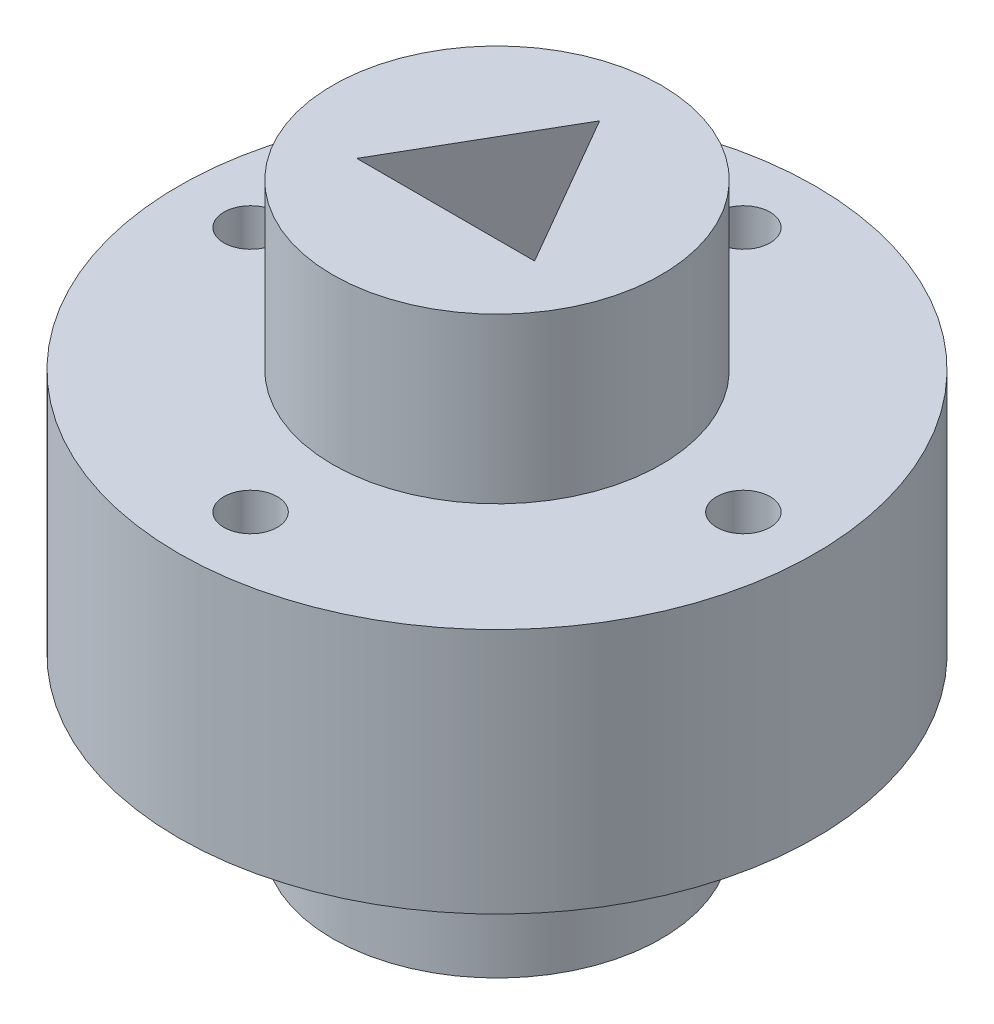
ISO-10303-21;
HEADER;
FILE_DESCRIPTION(('STEP AP214'),'2;1');
FILE_NAME('part.step','',(''),(''),'','','');
FILE_SCHEMA(('AUTOMOTIVE_DESIGN { 1 0 10303 214 1 1 1 1 }'));
ENDSEC;
DATA;
#1=APPLICATION_CONTEXT('core data for automotive mechanical design processes');
#2=APPLICATION_PROTOCOL_DEFINITION('international standard','automotive_design',2000,#1);
#3=PRODUCT_CONTEXT('',#1,'mechanical');
#4=PRODUCT('Part','Part','',(#3));
#5=PRODUCT_RELATED_PRODUCT_CATEGORY('part','',(#4));
#6=PRODUCT_DEFINITION_FORMATION('','',#4);
#7=PRODUCT_DEFINITION_CONTEXT('part definition',#1,'design');
#8=PRODUCT_DEFINITION('design','',#6,#7);
#9=PRODUCT_DEFINITION_SHAPE('','',#8);
#10=(LENGTH_UNIT() NAMED_UNIT(*) SI_UNIT(.MILLI.,.METRE.));
#11=(NAMED_UNIT(*) PLANE_ANGLE_UNIT() SI_UNIT($,.RADIAN.));
#12=(NAMED_UNIT(*) SI_UNIT($,.STERADIAN.) SOLID_ANGLE_UNIT());
#13=UNCERTAINTY_MEASURE_WITH_UNIT(LENGTH_MEASURE(1.E-05),#10,'distance_accuracy_value','');
#14=(GEOMETRIC_REPRESENTATION_CONTEXT(3) GLOBAL_UNCERTAINTY_ASSIGNED_CONTEXT((#13)) GLOBAL_UNIT_ASSIGNED_CONTEXT((#10,
#11,#12)) REPRESENTATION_CONTEXT('',''));
#15=CARTESIAN_POINT('',(0.,0.,0.));
#16=DIRECTION('',(0.,0.,1.));
#17=DIRECTION('',(1.,0.,0.));
#18=AXIS2_PLACEMENT_3D('',#15,#16,#17);
#19=CARTESIAN_POINT('',(0.,0.,0.));
#20=DIRECTION('',(0.,1.,0.));
#21=DIRECTION('',(0.,0.,1.));
#22=AXIS2_PLACEMENT_3D('',#19,#20,#21);
#23=PLANE('',#22);
#24=CARTESIAN_POINT('',(0.,0.,0.));
#25=DIRECTION('',(0.,1.,0.));
#26=DIRECTION('',(0.,0.,1.));
#27=AXIS2_PLACEMENT_3D('',#24,#25,#26);
#28=CIRCLE('',#27,4.);
#29=CARTESIAN_POINT('',(0.,0.,4.));
#30=VERTEX_POINT('',#29);
#31=EDGE_CURVE('E37',#30,#30,#28,.T.);
#32=ORIENTED_EDGE('',*,*,#31,.F.);
#33=EDGE_LOOP('',(#32));
#34=FACE_BOUND('',#33,.T.);
#35=DIRECTION('',(0.500000000000004,0.,0.866025403784436));
#36=VECTOR('',#35,1.);
#37=CARTESIAN_POINT('',(1.08253175473055,0.,-0.625000000000011));
#38=LINE('',#37,#36);
#39=CARTESIAN_POINT('',(0.,0.,-2.5));
#40=VERTEX_POINT('',#39);
#41=CARTESIAN_POINT('',(2.16506350946111,0.,1.24999999999998));
#42=VERTEX_POINT('',#41);
#43=EDGE_CURVE('E94',#40,#42,#38,.T.);
#44=ORIENTED_EDGE('',*,*,#43,.F.);
#45=DIRECTION('',(-0.500000000000004,0.,0.866025403784436));
#46=VECTOR('',#45,1.);
#47=CARTESIAN_POINT('',(-1.08253175473055,0.,-0.62500000000001));
#48=LINE('',#47,#46);
#49=CARTESIAN_POINT('',(-2.16506350946111,0.,1.24999999999998));
#50=VERTEX_POINT('',#49);
#51=EDGE_CURVE('E90',#40,#50,#48,.T.);
#52=ORIENTED_EDGE('',*,*,#51,.T.);
#53=DIRECTION('',(1.,0.,0.));
#54=VECTOR('',#53,1.);
#55=CARTESIAN_POINT('',(0.,0.,1.24999999999998));
#56=LINE('',#55,#54);
#57=EDGE_CURVE('E75',#50,#42,#56,.T.);
#58=ORIENTED_EDGE('',*,*,#57,.T.);
#59=EDGE_LOOP('',(#44,#52,#58));
#60=FACE_BOUND('',#59,.T.);
#61=ADVANCED_FACE('F33',(#34,#60),#23,.F.);
#62=CARTESIAN_POINT('',(0.,14.,0.));
#63=DIRECTION('',(0.,1.,0.));
#64=DIRECTION('',(0.,0.,1.));
#65=AXIS2_PLACEMENT_3D('',#62,#63,#64);
#66=PLANE('',#65);
#67=CARTESIAN_POINT('',(0.,14.,0.));
#68=DIRECTION('',(0.,1.,0.));
#69=DIRECTION('',(0.,0.,1.));
#70=AXIS2_PLACEMENT_3D('',#67,#68,#69);
#71=CIRCLE('',#70,4.);
#72=CARTESIAN_POINT('',(0.,14.,4.));
#73=VERTEX_POINT('',#72);
#74=EDGE_CURVE('E96',#73,#73,#71,.T.);
#75=ORIENTED_EDGE('',*,*,#74,.T.);
#76=EDGE_LOOP('',(#75));
#77=FACE_BOUND('',#76,.T.);
#78=DIRECTION('',(-0.500000000000004,0.,0.866025403784436));
#79=VECTOR('',#78,1.);
#80=CARTESIAN_POINT('',(-1.08253175473055,14.,-0.62500000000001));
#81=LINE('',#80,#79);
#82=CARTESIAN_POINT('',(0.,14.,-2.5));
#83=VERTEX_POINT('',#82);
#84=CARTESIAN_POINT('',(-2.16506350946111,14.,1.24999999999998));
#85=VERTEX_POINT('',#84);
#86=EDGE_CURVE('E81',#83,#85,#81,.T.);
#87=ORIENTED_EDGE('',*,*,#86,.F.);
#88=DIRECTION('',(0.500000000000004,0.,0.866025403784436));
#89=VECTOR('',#88,1.);
#90=CARTESIAN_POINT('',(1.08253175473055,14.,-0.62500000000001));
#91=LINE('',#90,#89);
#92=CARTESIAN_POINT('',(2.16506350946111,14.,1.24999999999998));
#93=VERTEX_POINT('',#92);
#94=EDGE_CURVE('E58',#83,#93,#91,.T.);
#95=ORIENTED_EDGE('',*,*,#94,.T.);
#96=DIRECTION('',(1.,0.,0.));
#97=VECTOR('',#96,1.);
#98=CARTESIAN_POINT('',(0.,14.,1.24999999999998));
#99=LINE('',#98,#97);
#100=EDGE_CURVE('E73',#85,#93,#99,.T.);
#101=ORIENTED_EDGE('',*,*,#100,.F.);
#102=EDGE_LOOP('',(#87,#95,#101));
#103=FACE_BOUND('',#102,.T.);
#104=ADVANCED_FACE('F85',(#77,#103),#66,.T.);
#105=CARTESIAN_POINT('',(0.,4.,0.));
#106=DIRECTION('',(0.,-1.,0.));
#107=DIRECTION('',(0.,0.,-1.));
#108=AXIS2_PLACEMENT_3D('',#105,#106,#107);
#109=CYLINDRICAL_SURFACE('',#108,4.);
#110=CARTESIAN_POINT('',(0.,4.,0.));
#111=DIRECTION('',(0.,1.,0.));
#112=DIRECTION('',(0.,0.,1.));
#113=AXIS2_PLACEMENT_3D('',#110,#111,#112);
#114=CIRCLE('',#113,4.);
#115=CARTESIAN_POINT('',(0.,4.,4.));
#116=VERTEX_POINT('',#115);
#117=EDGE_CURVE('E42',#116,#116,#114,.T.);
#118=ORIENTED_EDGE('',*,*,#117,.F.);
#119=EDGE_LOOP('',(#118));
#120=FACE_BOUND('',#119,.T.);
#121=ORIENTED_EDGE('',*,*,#31,.T.);
#122=EDGE_LOOP('',(#121));
#123=FACE_BOUND('',#122,.T.);
#124=ADVANCED_FACE('F35',(#120,#123),#109,.T.);
#125=CARTESIAN_POINT('',(0.,10.,0.));
#126=DIRECTION('',(0.,1.,0.));
#127=DIRECTION('',(0.,0.,1.));
#128=AXIS2_PLACEMENT_3D('',#125,#126,#127);
#129=PLANE('',#128);
#130=CARTESIAN_POINT('',(0.,10.,0.));
#131=DIRECTION('',(0.,1.,0.));
#132=DIRECTION('',(0.,0.,1.));
#133=AXIS2_PLACEMENT_3D('',#130,#131,#132);
#134=CIRCLE('',#133,4.);
#135=CARTESIAN_POINT('',(0.,10.,4.));
#136=VERTEX_POINT('',#135);
#137=EDGE_CURVE('E11',#136,#136,#134,.T.);
#138=ORIENTED_EDGE('',*,*,#137,.F.);
#139=EDGE_LOOP('',(#138));
#140=FACE_BOUND('',#139,.T.);
#141=CARTESIAN_POINT('',(3.39723510664371E-13,10.,6.));
#142=DIRECTION('',(0.,1.,0.));
#143=DIRECTION('',(0.,0.,1.));
#144=AXIS2_PLACEMENT_3D('',#141,#142,#143);
#145=CIRCLE('',#144,0.650000000000365);
#146=CARTESIAN_POINT('',(3.39723510664371E-13,10.,6.65000000000037));
#147=VERTEX_POINT('',#146);
#148=EDGE_CURVE('E106',#147,#147,#145,.T.);
#149=ORIENTED_EDGE('',*,*,#148,.F.);
#150=EDGE_LOOP('',(#149));
#151=FACE_BOUND('',#150,.T.);
#152=CARTESIAN_POINT('',(0.,10.,-6.));
#153=DIRECTION('',(0.,1.,0.));
#154=DIRECTION('',(0.,0.,1.));
#155=AXIS2_PLACEMENT_3D('',#152,#153,#154);
#156=CIRCLE('',#155,0.65);
#157=CARTESIAN_POINT('',(0.,10.,-5.35));
#158=VERTEX_POINT('',#157);
#159=EDGE_CURVE('E118',#158,#158,#156,.T.);
#160=ORIENTED_EDGE('',*,*,#159,.F.);
#161=EDGE_LOOP('',(#160));
#162=FACE_BOUND('',#161,.T.);
#163=CARTESIAN_POINT('',(0.,10.,0.));
#164=DIRECTION('',(0.,1.,0.));
#165=DIRECTION('',(0.,0.,1.));
#166=AXIS2_PLACEMENT_3D('',#163,#164,#165);
#167=CIRCLE('',#166,7.75);
#168=CARTESIAN_POINT('',(0.,10.,7.75));
#169=VERTEX_POINT('',#168);
#170=EDGE_CURVE('E124',#169,#169,#167,.T.);
#171=ORIENTED_EDGE('',*,*,#170,.T.);
#172=EDGE_LOOP('',(#171));
#173=FACE_BOUND('',#172,.T.);
#174=CARTESIAN_POINT('',(6.00000000000017,10.,-1.69428074463191E-13));
#175=DIRECTION('',(0.,1.,0.));
#176=DIRECTION('',(0.,0.,1.));
#177=AXIS2_PLACEMENT_3D('',#174,#175,#176);
#178=CIRCLE('',#177,0.650000000000133);
#179=CARTESIAN_POINT('',(6.00000000000017,10.,0.649999999999963));
#180=VERTEX_POINT('',#179);
#181=EDGE_CURVE('E112',#180,#180,#178,.T.);
#182=ORIENTED_EDGE('',*,*,#181,.F.);
#183=EDGE_LOOP('',(#182));
#184=FACE_BOUND('',#183,.T.);
#185=CARTESIAN_POINT('',(-5.99999999999983,10.,1.7016286254268E-13));
#186=DIRECTION('',(0.,1.,0.));
#187=DIRECTION('',(0.,0.,1.));
#188=AXIS2_PLACEMENT_3D('',#185,#186,#187);
#189=CIRCLE('',#188,0.650000000000273);
#190=CARTESIAN_POINT('',(-5.99999999999983,10.,0.650000000000443));
#191=VERTEX_POINT('',#190);
#192=EDGE_CURVE('E100',#191,#191,#189,.T.);
#193=ORIENTED_EDGE('',*,*,#192,.F.);
#194=EDGE_LOOP('',(#193));
#195=FACE_BOUND('',#194,.T.);
#196=ADVANCED_FACE('F171',(#140,#151,#162,#173,#184,#195),#129,.T.);
#197=CARTESIAN_POINT('',(0.,4.,0.));
#198=DIRECTION('',(0.,1.,0.));
#199=DIRECTION('',(0.,0.,1.));
#200=AXIS2_PLACEMENT_3D('',#197,#198,#199);
#201=PLANE('',#200);
#202=ORIENTED_EDGE('',*,*,#117,.T.);
#203=EDGE_LOOP('',(#202));
#204=FACE_BOUND('',#203,.T.);
#205=CARTESIAN_POINT('',(0.,4.,0.));
#206=DIRECTION('',(0.,1.,0.));
#207=DIRECTION('',(0.,0.,1.));
#208=AXIS2_PLACEMENT_3D('',#205,#206,#207);
#209=CIRCLE('',#208,7.75);
#210=CARTESIAN_POINT('',(0.,4.,7.75));
#211=VERTEX_POINT('',#210);
#212=EDGE_CURVE('E121',#211,#211,#209,.T.);
#213=ORIENTED_EDGE('',*,*,#212,.F.);
#214=EDGE_LOOP('',(#213));
#215=FACE_BOUND('',#214,.T.);
#216=CARTESIAN_POINT('',(0.,4.,-6.));
#217=DIRECTION('',(0.,1.,0.));
#218=DIRECTION('',(0.,0.,1.));
#219=AXIS2_PLACEMENT_3D('',#216,#217,#218);
#220=CIRCLE('',#219,0.65);
#221=CARTESIAN_POINT('',(0.,4.,-5.35));
#222=VERTEX_POINT('',#221);
#223=EDGE_CURVE('E115',#222,#222,#220,.T.);
#224=ORIENTED_EDGE('',*,*,#223,.T.);
#225=EDGE_LOOP('',(#224));
#226=FACE_BOUND('',#225,.T.);
#227=CARTESIAN_POINT('',(6.00000000000017,4.,-1.69428074463191E-13));
#228=DIRECTION('',(0.,1.,0.));
#229=DIRECTION('',(0.,0.,1.));
#230=AXIS2_PLACEMENT_3D('',#227,#228,#229);
#231=CIRCLE('',#230,0.650000000000133);
#232=CARTESIAN_POINT('',(6.00000000000017,4.,0.649999999999963));
#233=VERTEX_POINT('',#232);
#234=EDGE_CURVE('E109',#233,#233,#231,.T.);
#235=ORIENTED_EDGE('',*,*,#234,.T.);
#236=EDGE_LOOP('',(#235));
#237=FACE_BOUND('',#236,.T.);
#238=CARTESIAN_POINT('',(3.39723510664371E-13,4.,6.));
#239=DIRECTION('',(0.,1.,0.));
#240=DIRECTION('',(0.,0.,1.));
#241=AXIS2_PLACEMENT_3D('',#238,#239,#240);
#242=CIRCLE('',#241,0.650000000000365);
#243=CARTESIAN_POINT('',(3.39723510664371E-13,4.,6.65000000000037));
#244=VERTEX_POINT('',#243);
#245=EDGE_CURVE('E103',#244,#244,#242,.T.);
#246=ORIENTED_EDGE('',*,*,#245,.T.);
#247=EDGE_LOOP('',(#246));
#248=FACE_BOUND('',#247,.T.);
#249=CARTESIAN_POINT('',(-5.99999999999983,4.,1.7016286254268E-13));
#250=DIRECTION('',(0.,1.,0.));
#251=DIRECTION('',(0.,0.,1.));
#252=AXIS2_PLACEMENT_3D('',#249,#250,#251);
#253=CIRCLE('',#252,0.650000000000273);
#254=CARTESIAN_POINT('',(-5.99999999999983,4.,0.650000000000443));
#255=VERTEX_POINT('',#254);
#256=EDGE_CURVE('E98',#255,#255,#253,.T.);
#257=ORIENTED_EDGE('',*,*,#256,.T.);
#258=EDGE_LOOP('',(#257));
#259=FACE_BOUND('',#258,.T.);
#260=ADVANCED_FACE('F174',(#204,#215,#226,#237,#248,#259),#201,.F.);
#261=CARTESIAN_POINT('',(0.,10.,0.));
#262=DIRECTION('',(0.,-1.,0.));
#263=DIRECTION('',(0.,0.,-1.));
#264=AXIS2_PLACEMENT_3D('',#261,#262,#263);
#265=CYLINDRICAL_SURFACE('',#264,7.75);
#266=ORIENTED_EDGE('',*,*,#170,.F.);
#267=EDGE_LOOP('',(#266));
#268=FACE_BOUND('',#267,.T.);
#269=ORIENTED_EDGE('',*,*,#212,.T.);
#270=EDGE_LOOP('',(#269));
#271=FACE_BOUND('',#270,.T.);
#272=ADVANCED_FACE('F169',(#268,#271),#265,.T.);
#273=CARTESIAN_POINT('',(0.,10.,-6.));
#274=DIRECTION('',(0.,-1.,0.));
#275=DIRECTION('',(0.,0.,-1.));
#276=AXIS2_PLACEMENT_3D('',#273,#274,#275);
#277=CYLINDRICAL_SURFACE('',#276,0.65);
#278=ORIENTED_EDGE('',*,*,#159,.T.);
#279=EDGE_LOOP('',(#278));
#280=FACE_BOUND('',#279,.T.);
#281=ORIENTED_EDGE('',*,*,#223,.F.);
#282=EDGE_LOOP('',(#281));
#283=FACE_BOUND('',#282,.T.);
#284=ADVANCED_FACE('F165',(#280,#283),#277,.F.);
#285=CARTESIAN_POINT('',(6.00000000000017,10.,-1.69428074463191E-13));
#286=DIRECTION('',(0.,-1.,0.));
#287=DIRECTION('',(0.,0.,-1.));
#288=AXIS2_PLACEMENT_3D('',#285,#286,#287);
#289=CYLINDRICAL_SURFACE('',#288,0.650000000000133);
#290=ORIENTED_EDGE('',*,*,#181,.T.);
#291=EDGE_LOOP('',(#290));
#292=FACE_BOUND('',#291,.T.);
#293=ORIENTED_EDGE('',*,*,#234,.F.);
#294=EDGE_LOOP('',(#293));
#295=FACE_BOUND('',#294,.T.);
#296=ADVANCED_FACE('F161',(#292,#295),#289,.F.);
#297=CARTESIAN_POINT('',(3.39723510664371E-13,10.,6.));
#298=DIRECTION('',(0.,-1.,0.));
#299=DIRECTION('',(0.,0.,-1.));
#300=AXIS2_PLACEMENT_3D('',#297,#298,#299);
#301=CYLINDRICAL_SURFACE('',#300,0.650000000000365);
#302=ORIENTED_EDGE('',*,*,#148,.T.);
#303=EDGE_LOOP('',(#302));
#304=FACE_BOUND('',#303,.T.);
#305=ORIENTED_EDGE('',*,*,#245,.F.);
#306=EDGE_LOOP('',(#305));
#307=FACE_BOUND('',#306,.T.);
#308=ADVANCED_FACE('F157',(#304,#307),#301,.F.);
#309=CARTESIAN_POINT('',(-5.99999999999983,10.,1.7016286254268E-13));
#310=DIRECTION('',(0.,-1.,0.));
#311=DIRECTION('',(0.,0.,-1.));
#312=AXIS2_PLACEMENT_3D('',#309,#310,#311);
#313=CYLINDRICAL_SURFACE('',#312,0.650000000000273);
#314=ORIENTED_EDGE('',*,*,#192,.T.);
#315=EDGE_LOOP('',(#314));
#316=FACE_BOUND('',#315,.T.);
#317=ORIENTED_EDGE('',*,*,#256,.F.);
#318=EDGE_LOOP('',(#317));
#319=FACE_BOUND('',#318,.T.);
#320=ADVANCED_FACE('F147',(#316,#319),#313,.F.);
#321=CARTESIAN_POINT('',(0.,14.,0.));
#322=DIRECTION('',(0.,-1.,0.));
#323=DIRECTION('',(0.,0.,-1.));
#324=AXIS2_PLACEMENT_3D('',#321,#322,#323);
#325=CYLINDRICAL_SURFACE('',#324,4.);
#326=ORIENTED_EDGE('',*,*,#74,.F.);
#327=EDGE_LOOP('',(#326));
#328=FACE_BOUND('',#327,.T.);
#329=ORIENTED_EDGE('',*,*,#137,.T.);
#330=EDGE_LOOP('',(#329));
#331=FACE_BOUND('',#330,.T.);
#332=ADVANCED_FACE('F140',(#328,#331),#325,.T.);
#333=CARTESIAN_POINT('',(1.08253175473055,-10.,-0.62500000000001));
#334=DIRECTION('',(-0.866025403784436,0.,0.500000000000004));
#335=DIRECTION('',(0.500000000000004,0.,0.866025403784436));
#336=AXIS2_PLACEMENT_3D('',#333,#334,#335);
#337=PLANE('',#336);
#338=ORIENTED_EDGE('',*,*,#43,.T.);
#339=DIRECTION('',(0.,1.,0.));
#340=VECTOR('',#339,1.);
#341=CARTESIAN_POINT('',(2.16506350946111,-10.,1.24999999999998));
#342=LINE('',#341,#340);
#343=EDGE_CURVE('E77',#42,#93,#342,.T.);
#344=ORIENTED_EDGE('',*,*,#343,.T.);
#345=ORIENTED_EDGE('',*,*,#94,.F.);
#346=DIRECTION('',(0.,1.,0.));
#347=VECTOR('',#346,1.);
#348=CARTESIAN_POINT('',(0.,-10.,-2.5));
#349=LINE('',#348,#347);
#350=EDGE_CURVE('E78',#40,#83,#349,.T.);
#351=ORIENTED_EDGE('',*,*,#350,.F.);
#352=EDGE_LOOP('',(#338,#344,#345,#351));
#353=FACE_BOUND('',#352,.T.);
#354=ADVANCED_FACE('F138',(#353),#337,.T.);
#355=CARTESIAN_POINT('',(0.,-10.,1.24999999999998));
#356=DIRECTION('',(0.,0.,1.));
#357=DIRECTION('',(1.,0.,0.));
#358=AXIS2_PLACEMENT_3D('',#355,#356,#357);
#359=PLANE('',#358);
#360=DIRECTION('',(0.,1.,0.));
#361=VECTOR('',#360,1.);
#362=CARTESIAN_POINT('',(-2.16506350946111,-10.,1.24999999999998));
#363=LINE('',#362,#361);
#364=EDGE_CURVE('E50',#50,#85,#363,.T.);
#365=ORIENTED_EDGE('',*,*,#364,.T.);
#366=ORIENTED_EDGE('',*,*,#100,.T.);
#367=ORIENTED_EDGE('',*,*,#343,.F.);
#368=ORIENTED_EDGE('',*,*,#57,.F.);
#369=EDGE_LOOP('',(#365,#366,#367,#368));
#370=FACE_BOUND('',#369,.T.);
#371=ADVANCED_FACE('F70',(#370),#359,.F.);
#372=CARTESIAN_POINT('',(-1.08253175473055,-10.,-0.62500000000001));
#373=DIRECTION('',(-0.866025403784436,0.,-0.500000000000004));
#374=DIRECTION('',(-0.500000000000004,0.,0.866025403784436));
#375=AXIS2_PLACEMENT_3D('',#372,#373,#374);
#376=PLANE('',#375);
#377=ORIENTED_EDGE('',*,*,#350,.T.);
#378=ORIENTED_EDGE('',*,*,#86,.T.);
#379=ORIENTED_EDGE('',*,*,#364,.F.);
#380=ORIENTED_EDGE('',*,*,#51,.F.);
#381=EDGE_LOOP('',(#377,#378,#379,#380));
#382=FACE_BOUND('',#381,.T.);
#383=ADVANCED_FACE('F82',(#382),#376,.F.);
#384=CLOSED_SHELL('',(#61,#104,#124,#196,#260,#272,#284,#296,#308,#320,#332,#354,#371,#383));
#385=MANIFOLD_SOLID_BREP('B2',#384);
#386=ADVANCED_BREP_SHAPE_REPRESENTATION('',(#18,#385),#14);
#387=SHAPE_DEFINITION_REPRESENTATION(#9,#386);
ENDSEC;
END-ISO-10303-21;
